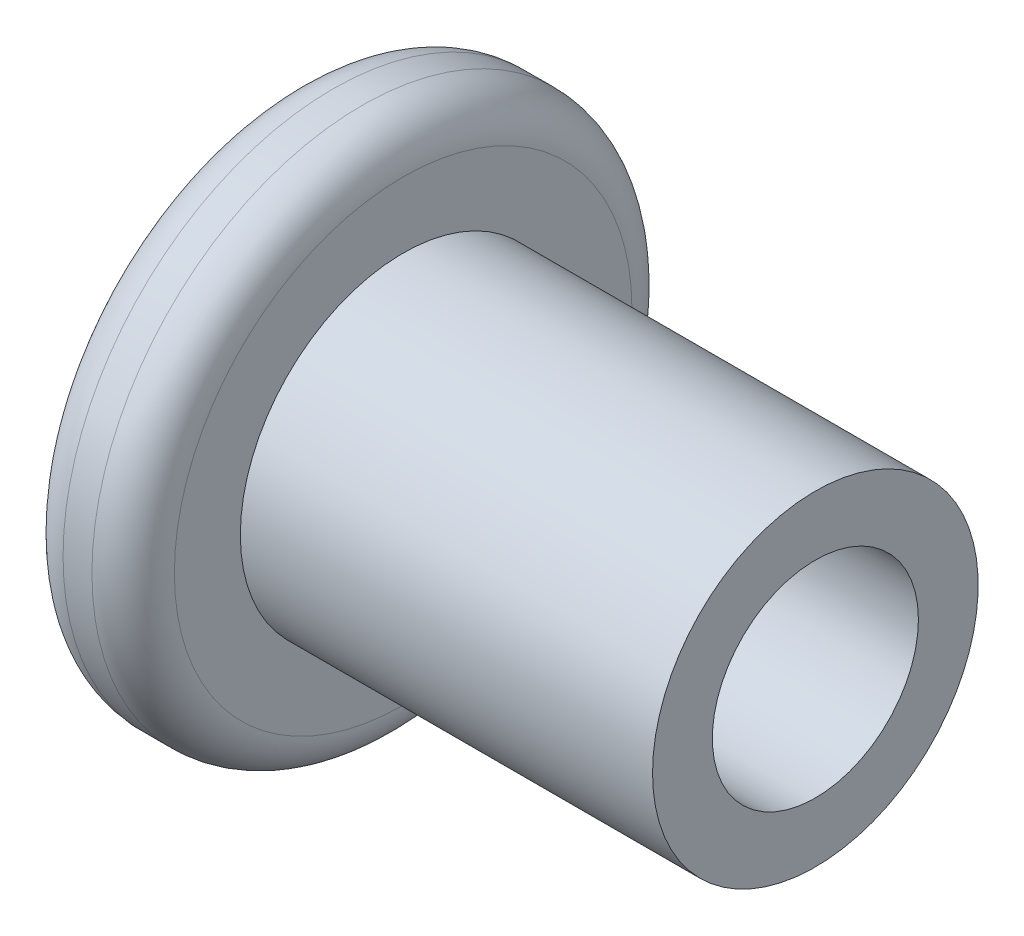
ISO-10303-21;
HEADER;
FILE_DESCRIPTION(('STEP AP214'),'2;1');
FILE_NAME('part.step','',(''),(''),'','','');
FILE_SCHEMA(('AUTOMOTIVE_DESIGN { 1 0 10303 214 1 1 1 1 }'));
ENDSEC;
DATA;
#1=APPLICATION_CONTEXT('core data for automotive mechanical design processes');
#2=APPLICATION_PROTOCOL_DEFINITION('international standard','automotive_design',2000,#1);
#3=PRODUCT_CONTEXT('',#1,'mechanical');
#4=PRODUCT('Part','Part','',(#3));
#5=PRODUCT_RELATED_PRODUCT_CATEGORY('part','',(#4));
#6=PRODUCT_DEFINITION_FORMATION('','',#4);
#7=PRODUCT_DEFINITION_CONTEXT('part definition',#1,'design');
#8=PRODUCT_DEFINITION('design','',#6,#7);
#9=PRODUCT_DEFINITION_SHAPE('','',#8);
#10=(LENGTH_UNIT() NAMED_UNIT(*) SI_UNIT(.MILLI.,.METRE.));
#11=(NAMED_UNIT(*) PLANE_ANGLE_UNIT() SI_UNIT($,.RADIAN.));
#12=(NAMED_UNIT(*) SI_UNIT($,.STERADIAN.) SOLID_ANGLE_UNIT());
#13=UNCERTAINTY_MEASURE_WITH_UNIT(LENGTH_MEASURE(1.E-05),#10,'distance_accuracy_value','');
#14=(GEOMETRIC_REPRESENTATION_CONTEXT(3) GLOBAL_UNCERTAINTY_ASSIGNED_CONTEXT((#13)) GLOBAL_UNIT_ASSIGNED_CONTEXT((#10,
#11,#12)) REPRESENTATION_CONTEXT('',''));
#15=CARTESIAN_POINT('',(0.,0.,0.));
#16=DIRECTION('',(0.,0.,1.));
#17=DIRECTION('',(1.,0.,0.));
#18=AXIS2_PLACEMENT_3D('',#15,#16,#17);
#19=CARTESIAN_POINT('',(0.,0.,0.));
#20=DIRECTION('',(1.,0.,0.));
#21=DIRECTION('',(0.,0.,-1.));
#22=AXIS2_PLACEMENT_3D('',#19,#20,#21);
#23=PLANE('',#22);
#24=DIRECTION('',(0.,0.,-1.));
#25=VECTOR('',#24,1.);
#26=CARTESIAN_POINT('',(0.,2.,1.15470053837925));
#27=LINE('',#26,#25);
#28=CARTESIAN_POINT('',(0.,2.,1.15470053837925));
#29=VERTEX_POINT('',#28);
#30=CARTESIAN_POINT('',(0.,2.,-1.15470053837925));
#31=VERTEX_POINT('',#30);
#32=EDGE_CURVE('E131',#29,#31,#27,.T.);
#33=ORIENTED_EDGE('',*,*,#32,.F.);
#34=DIRECTION('',(0.,0.866025403784438,-0.5));
#35=VECTOR('',#34,1.);
#36=CARTESIAN_POINT('',(0.,0.,2.3094010767585));
#37=LINE('',#36,#35);
#38=CARTESIAN_POINT('',(0.,0.,2.3094010767585));
#39=VERTEX_POINT('',#38);
#40=EDGE_CURVE('E55',#39,#29,#37,.T.);
#41=ORIENTED_EDGE('',*,*,#40,.F.);
#42=DIRECTION('',(0.,0.866025403784439,0.5));
#43=VECTOR('',#42,1.);
#44=CARTESIAN_POINT('',(0.,-2.,1.15470053837925));
#45=LINE('',#44,#43);
#46=CARTESIAN_POINT('',(0.,-2.,1.15470053837925));
#47=VERTEX_POINT('',#46);
#48=EDGE_CURVE('E141',#47,#39,#45,.T.);
#49=ORIENTED_EDGE('',*,*,#48,.F.);
#50=DIRECTION('',(0.,0.,1.));
#51=VECTOR('',#50,1.);
#52=CARTESIAN_POINT('',(0.,-2.,-1.15470053837925));
#53=LINE('',#52,#51);
#54=CARTESIAN_POINT('',(0.,-2.,-1.15470053837925));
#55=VERTEX_POINT('',#54);
#56=EDGE_CURVE('E139',#55,#47,#53,.T.);
#57=ORIENTED_EDGE('',*,*,#56,.F.);
#58=DIRECTION('',(0.,-0.866025403784439,0.5));
#59=VECTOR('',#58,1.);
#60=CARTESIAN_POINT('',(0.,0.,-2.3094010767585));
#61=LINE('',#60,#59);
#62=CARTESIAN_POINT('',(0.,0.,-2.3094010767585));
#63=VERTEX_POINT('',#62);
#64=EDGE_CURVE('E105',#63,#55,#61,.T.);
#65=ORIENTED_EDGE('',*,*,#64,.F.);
#66=DIRECTION('',(0.,-0.866025403784439,-0.5));
#67=VECTOR('',#66,1.);
#68=CARTESIAN_POINT('',(0.,2.,-1.15470053837925));
#69=LINE('',#68,#67);
#70=EDGE_CURVE('E135',#31,#63,#69,.T.);
#71=ORIENTED_EDGE('',*,*,#70,.F.);
#72=EDGE_LOOP('',(#33,#41,#49,#57,#65,#71));
#73=FACE_BOUND('',#72,.T.);
#74=CARTESIAN_POINT('',(0.,0.,0.));
#75=DIRECTION('',(1.,0.,0.));
#76=DIRECTION('',(0.,0.,-1.));
#77=AXIS2_PLACEMENT_3D('',#74,#75,#76);
#78=CIRCLE('',#77,5.55);
#79=CARTESIAN_POINT('',(0.,0.,-5.55));
#80=VERTEX_POINT('',#79);
#81=EDGE_CURVE('E11',#80,#80,#78,.F.);
#82=ORIENTED_EDGE('',*,*,#81,.T.);
#83=EDGE_LOOP('',(#82));
#84=FACE_BOUND('',#83,.T.);
#85=ADVANCED_FACE('F40',(#73,#84),#23,.F.);
#86=CARTESIAN_POINT('',(0.,0.,0.));
#87=DIRECTION('',(-1.,0.,0.));
#88=DIRECTION('',(0.,0.,1.));
#89=AXIS2_PLACEMENT_3D('',#86,#87,#88);
#90=CYLINDRICAL_SURFACE('',#89,6.55);
#91=CARTESIAN_POINT('',(1.7,0.,0.));
#92=DIRECTION('',(-1.,0.,0.));
#93=DIRECTION('',(0.,0.,1.));
#94=AXIS2_PLACEMENT_3D('',#91,#92,#93);
#95=CIRCLE('',#94,6.55);
#96=CARTESIAN_POINT('',(1.7,0.,6.55));
#97=VERTEX_POINT('',#96);
#98=EDGE_CURVE('E159',#97,#97,#95,.T.);
#99=ORIENTED_EDGE('',*,*,#98,.T.);
#100=EDGE_LOOP('',(#99));
#101=FACE_BOUND('',#100,.T.);
#102=CARTESIAN_POINT('',(1.,0.,0.));
#103=DIRECTION('',(1.,0.,0.));
#104=DIRECTION('',(0.,0.,-1.));
#105=AXIS2_PLACEMENT_3D('',#102,#103,#104);
#106=CIRCLE('',#105,6.55);
#107=CARTESIAN_POINT('',(1.,0.,-6.55));
#108=VERTEX_POINT('',#107);
#109=EDGE_CURVE('E156',#108,#108,#106,.T.);
#110=ORIENTED_EDGE('',*,*,#109,.T.);
#111=EDGE_LOOP('',(#110));
#112=FACE_BOUND('',#111,.T.);
#113=ADVANCED_FACE('F173',(#101,#112),#90,.T.);
#114=CARTESIAN_POINT('',(2.7,6.55,0.));
#115=DIRECTION('',(-1.,0.,0.));
#116=DIRECTION('',(0.,0.,1.));
#117=AXIS2_PLACEMENT_3D('',#114,#115,#116);
#118=PLANE('',#117);
#119=CARTESIAN_POINT('',(2.7,0.,0.));
#120=DIRECTION('',(-1.,0.,0.));
#121=DIRECTION('',(0.,0.,1.));
#122=AXIS2_PLACEMENT_3D('',#119,#120,#121);
#123=CIRCLE('',#122,5.55);
#124=CARTESIAN_POINT('',(2.7,0.,5.55));
#125=VERTEX_POINT('',#124);
#126=EDGE_CURVE('E48',#125,#125,#123,.F.);
#127=ORIENTED_EDGE('',*,*,#126,.T.);
#128=EDGE_LOOP('',(#127));
#129=FACE_BOUND('',#128,.T.);
#130=CARTESIAN_POINT('',(2.7,0.,0.));
#131=DIRECTION('',(-1.,0.,0.));
#132=DIRECTION('',(0.,0.,1.));
#133=AXIS2_PLACEMENT_3D('',#130,#131,#132);
#134=CIRCLE('',#133,3.95);
#135=CARTESIAN_POINT('',(2.7,0.,3.95));
#136=VERTEX_POINT('',#135);
#137=EDGE_CURVE('E153',#136,#136,#134,.T.);
#138=ORIENTED_EDGE('',*,*,#137,.T.);
#139=EDGE_LOOP('',(#138));
#140=FACE_BOUND('',#139,.T.);
#141=ADVANCED_FACE('F164',(#129,#140),#118,.F.);
#142=CARTESIAN_POINT('',(0.,0.,0.));
#143=DIRECTION('',(-1.,0.,0.));
#144=DIRECTION('',(0.,0.,1.));
#145=AXIS2_PLACEMENT_3D('',#142,#143,#144);
#146=CYLINDRICAL_SURFACE('',#145,3.95);
#147=ORIENTED_EDGE('',*,*,#137,.F.);
#148=EDGE_LOOP('',(#147));
#149=FACE_BOUND('',#148,.T.);
#150=CARTESIAN_POINT('',(12.7,0.,0.));
#151=DIRECTION('',(-1.,0.,0.));
#152=DIRECTION('',(0.,0.,1.));
#153=AXIS2_PLACEMENT_3D('',#150,#151,#152);
#154=CIRCLE('',#153,3.95);
#155=CARTESIAN_POINT('',(12.7,0.,3.95));
#156=VERTEX_POINT('',#155);
#157=EDGE_CURVE('E145',#156,#156,#154,.T.);
#158=ORIENTED_EDGE('',*,*,#157,.T.);
#159=EDGE_LOOP('',(#158));
#160=FACE_BOUND('',#159,.T.);
#161=ADVANCED_FACE('F193',(#149,#160),#146,.T.);
#162=CARTESIAN_POINT('',(12.7,3.95,0.));
#163=DIRECTION('',(-1.,0.,0.));
#164=DIRECTION('',(0.,0.,1.));
#165=AXIS2_PLACEMENT_3D('',#162,#163,#164);
#166=PLANE('',#165);
#167=CARTESIAN_POINT('',(12.7,0.,0.));
#168=DIRECTION('',(1.,0.,0.));
#169=DIRECTION('',(0.,0.,-1.));
#170=AXIS2_PLACEMENT_3D('',#167,#168,#169);
#171=CIRCLE('',#170,2.5);
#172=CARTESIAN_POINT('',(12.7,0.,-2.5));
#173=VERTEX_POINT('',#172);
#174=EDGE_CURVE('E233',#173,#173,#171,.T.);
#175=ORIENTED_EDGE('',*,*,#174,.F.);
#176=EDGE_LOOP('',(#175));
#177=FACE_BOUND('',#176,.T.);
#178=ORIENTED_EDGE('',*,*,#157,.F.);
#179=EDGE_LOOP('',(#178));
#180=FACE_BOUND('',#179,.T.);
#181=ADVANCED_FACE('F170',(#177,#180),#166,.F.);
#182=CARTESIAN_POINT('',(1.7,0.,0.));
#183=DIRECTION('',(-1.,0.,0.));
#184=DIRECTION('',(0.,0.,1.));
#185=AXIS2_PLACEMENT_3D('',#182,#183,#184);
#186=TOROIDAL_SURFACE('',#185,5.55,1.);
#187=ORIENTED_EDGE('',*,*,#126,.F.);
#188=EDGE_LOOP('',(#187));
#189=FACE_BOUND('',#188,.T.);
#190=ORIENTED_EDGE('',*,*,#98,.F.);
#191=EDGE_LOOP('',(#190));
#192=FACE_BOUND('',#191,.T.);
#193=ADVANCED_FACE('F167',(#189,#192),#186,.T.);
#194=CARTESIAN_POINT('',(1.,0.,0.));
#195=DIRECTION('',(1.,0.,0.));
#196=DIRECTION('',(0.,0.,-1.));
#197=AXIS2_PLACEMENT_3D('',#194,#195,#196);
#198=TOROIDAL_SURFACE('',#197,5.55,1.);
#199=ORIENTED_EDGE('',*,*,#109,.F.);
#200=EDGE_LOOP('',(#199));
#201=FACE_BOUND('',#200,.T.);
#202=ORIENTED_EDGE('',*,*,#81,.F.);
#203=EDGE_LOOP('',(#202));
#204=FACE_BOUND('',#203,.T.);
#205=ADVANCED_FACE('F42',(#201,#204),#198,.T.);
#206=CARTESIAN_POINT('',(1.,0.,2.3094010767585));
#207=DIRECTION('',(0.,0.5,0.866025403784439));
#208=DIRECTION('',(0.,-0.866025403784439,0.5));
#209=AXIS2_PLACEMENT_3D('',#206,#207,#208);
#210=PLANE('',#209);
#211=ORIENTED_EDGE('',*,*,#40,.T.);
#212=DIRECTION('',(-1.,0.,0.));
#213=VECTOR('',#212,1.);
#214=CARTESIAN_POINT('',(1.,2.,1.15470053837925));
#215=LINE('',#214,#213);
#216=CARTESIAN_POINT('',(1.,2.,1.15470053837925));
#217=VERTEX_POINT('',#216);
#218=EDGE_CURVE('E86',#217,#29,#215,.T.);
#219=ORIENTED_EDGE('',*,*,#218,.F.);
#220=DIRECTION('',(0.,0.866025403784438,-0.5));
#221=VECTOR('',#220,1.);
#222=CARTESIAN_POINT('',(1.,0.,2.3094010767585));
#223=LINE('',#222,#221);
#224=CARTESIAN_POINT('',(1.,0.,2.3094010767585));
#225=VERTEX_POINT('',#224);
#226=EDGE_CURVE('E143',#225,#217,#223,.T.);
#227=ORIENTED_EDGE('',*,*,#226,.F.);
#228=DIRECTION('',(-1.,0.,0.));
#229=VECTOR('',#228,1.);
#230=CARTESIAN_POINT('',(1.,0.,2.3094010767585));
#231=LINE('',#230,#229);
#232=EDGE_CURVE('E63',#225,#39,#231,.T.);
#233=ORIENTED_EDGE('',*,*,#232,.T.);
#234=EDGE_LOOP('',(#211,#219,#227,#233));
#235=FACE_BOUND('',#234,.T.);
#236=ADVANCED_FACE('F181',(#235),#210,.F.);
#237=CARTESIAN_POINT('',(1.,-2.,1.15470053837925));
#238=DIRECTION('',(0.,-0.5,0.866025403784439));
#239=DIRECTION('',(0.,-0.866025403784439,-0.5));
#240=AXIS2_PLACEMENT_3D('',#237,#238,#239);
#241=PLANE('',#240);
#242=ORIENTED_EDGE('',*,*,#48,.T.);
#243=ORIENTED_EDGE('',*,*,#232,.F.);
#244=DIRECTION('',(0.,0.866025403784439,0.5));
#245=VECTOR('',#244,1.);
#246=CARTESIAN_POINT('',(1.,-2.,1.15470053837925));
#247=LINE('',#246,#245);
#248=CARTESIAN_POINT('',(1.,-2.,1.15470053837925));
#249=VERTEX_POINT('',#248);
#250=EDGE_CURVE('E117',#249,#225,#247,.T.);
#251=ORIENTED_EDGE('',*,*,#250,.F.);
#252=DIRECTION('',(-1.,0.,0.));
#253=VECTOR('',#252,1.);
#254=CARTESIAN_POINT('',(1.,-2.,1.15470053837925));
#255=LINE('',#254,#253);
#256=EDGE_CURVE('E109',#249,#47,#255,.T.);
#257=ORIENTED_EDGE('',*,*,#256,.T.);
#258=EDGE_LOOP('',(#242,#243,#251,#257));
#259=FACE_BOUND('',#258,.T.);
#260=ADVANCED_FACE('F202',(#259),#241,.F.);
#261=CARTESIAN_POINT('',(1.,-2.,-1.15470053837925));
#262=DIRECTION('',(0.,-1.,0.));
#263=DIRECTION('',(0.,0.,-1.));
#264=AXIS2_PLACEMENT_3D('',#261,#262,#263);
#265=PLANE('',#264);
#266=ORIENTED_EDGE('',*,*,#56,.T.);
#267=ORIENTED_EDGE('',*,*,#256,.F.);
#268=DIRECTION('',(0.,0.,1.));
#269=VECTOR('',#268,1.);
#270=CARTESIAN_POINT('',(1.,-2.,-1.15470053837925));
#271=LINE('',#270,#269);
#272=CARTESIAN_POINT('',(1.,-2.,-1.15470053837925));
#273=VERTEX_POINT('',#272);
#274=EDGE_CURVE('E113',#273,#249,#271,.T.);
#275=ORIENTED_EDGE('',*,*,#274,.F.);
#276=DIRECTION('',(-1.,0.,0.));
#277=VECTOR('',#276,1.);
#278=CARTESIAN_POINT('',(1.,-2.,-1.15470053837925));
#279=LINE('',#278,#277);
#280=EDGE_CURVE('E98',#273,#55,#279,.T.);
#281=ORIENTED_EDGE('',*,*,#280,.T.);
#282=EDGE_LOOP('',(#266,#267,#275,#281));
#283=FACE_BOUND('',#282,.T.);
#284=ADVANCED_FACE('F114',(#283),#265,.F.);
#285=CARTESIAN_POINT('',(1.,0.,-2.3094010767585));
#286=DIRECTION('',(0.,-0.5,-0.866025403784439));
#287=DIRECTION('',(0.,0.866025403784439,-0.5));
#288=AXIS2_PLACEMENT_3D('',#285,#286,#287);
#289=PLANE('',#288);
#290=ORIENTED_EDGE('',*,*,#64,.T.);
#291=ORIENTED_EDGE('',*,*,#280,.F.);
#292=DIRECTION('',(0.,-0.866025403784439,0.5));
#293=VECTOR('',#292,1.);
#294=CARTESIAN_POINT('',(1.,0.,-2.3094010767585));
#295=LINE('',#294,#293);
#296=CARTESIAN_POINT('',(1.,0.,-2.3094010767585));
#297=VERTEX_POINT('',#296);
#298=EDGE_CURVE('E102',#297,#273,#295,.T.);
#299=ORIENTED_EDGE('',*,*,#298,.F.);
#300=DIRECTION('',(-1.,0.,0.));
#301=VECTOR('',#300,1.);
#302=CARTESIAN_POINT('',(1.,0.,-2.3094010767585));
#303=LINE('',#302,#301);
#304=EDGE_CURVE('E110',#297,#63,#303,.T.);
#305=ORIENTED_EDGE('',*,*,#304,.T.);
#306=EDGE_LOOP('',(#290,#291,#299,#305));
#307=FACE_BOUND('',#306,.T.);
#308=ADVANCED_FACE('F100',(#307),#289,.F.);
#309=CARTESIAN_POINT('',(1.,2.,-1.15470053837925));
#310=DIRECTION('',(0.,0.5,-0.866025403784439));
#311=DIRECTION('',(0.,0.866025403784439,0.5));
#312=AXIS2_PLACEMENT_3D('',#309,#310,#311);
#313=PLANE('',#312);
#314=ORIENTED_EDGE('',*,*,#70,.T.);
#315=ORIENTED_EDGE('',*,*,#304,.F.);
#316=DIRECTION('',(0.,-0.866025403784439,-0.5));
#317=VECTOR('',#316,1.);
#318=CARTESIAN_POINT('',(1.,2.,-1.15470053837925));
#319=LINE('',#318,#317);
#320=CARTESIAN_POINT('',(1.,2.,-1.15470053837925));
#321=VERTEX_POINT('',#320);
#322=EDGE_CURVE('E123',#321,#297,#319,.T.);
#323=ORIENTED_EDGE('',*,*,#322,.F.);
#324=DIRECTION('',(-1.,0.,0.));
#325=VECTOR('',#324,1.);
#326=CARTESIAN_POINT('',(1.,2.,-1.15470053837925));
#327=LINE('',#326,#325);
#328=EDGE_CURVE('E148',#321,#31,#327,.T.);
#329=ORIENTED_EDGE('',*,*,#328,.T.);
#330=EDGE_LOOP('',(#314,#315,#323,#329));
#331=FACE_BOUND('',#330,.T.);
#332=ADVANCED_FACE('F206',(#331),#313,.F.);
#333=CARTESIAN_POINT('',(1.,2.,1.15470053837925));
#334=DIRECTION('',(0.,1.,0.));
#335=DIRECTION('',(0.,0.,1.));
#336=AXIS2_PLACEMENT_3D('',#333,#334,#335);
#337=PLANE('',#336);
#338=ORIENTED_EDGE('',*,*,#32,.T.);
#339=ORIENTED_EDGE('',*,*,#328,.F.);
#340=DIRECTION('',(0.,0.,-1.));
#341=VECTOR('',#340,1.);
#342=CARTESIAN_POINT('',(1.,2.,1.15470053837925));
#343=LINE('',#342,#341);
#344=EDGE_CURVE('E125',#217,#321,#343,.T.);
#345=ORIENTED_EDGE('',*,*,#344,.F.);
#346=ORIENTED_EDGE('',*,*,#218,.T.);
#347=EDGE_LOOP('',(#338,#339,#345,#346));
#348=FACE_BOUND('',#347,.T.);
#349=ADVANCED_FACE('F203',(#348),#337,.F.);
#350=CARTESIAN_POINT('',(1.,0.,0.));
#351=DIRECTION('',(-1.,0.,0.));
#352=DIRECTION('',(0.,0.,1.));
#353=AXIS2_PLACEMENT_3D('',#350,#351,#352);
#354=PLANE('',#353);
#355=ORIENTED_EDGE('',*,*,#226,.T.);
#356=ORIENTED_EDGE('',*,*,#344,.T.);
#357=ORIENTED_EDGE('',*,*,#322,.T.);
#358=ORIENTED_EDGE('',*,*,#298,.T.);
#359=ORIENTED_EDGE('',*,*,#274,.T.);
#360=ORIENTED_EDGE('',*,*,#250,.T.);
#361=EDGE_LOOP('',(#355,#356,#357,#358,#359,#360));
#362=FACE_BOUND('',#361,.T.);
#363=ADVANCED_FACE('F120',(#362),#354,.T.);
#364=CARTESIAN_POINT('',(8.6,0.,0.));
#365=DIRECTION('',(1.,0.,0.));
#366=DIRECTION('',(0.,0.,-1.));
#367=AXIS2_PLACEMENT_3D('',#364,#365,#366);
#368=CONICAL_SURFACE('',#367,2.5,1.02974425867665);
#369=CARTESIAN_POINT('',(7.0978484524311,0.,0.));
#370=VERTEX_POINT('',#369);
#371=VERTEX_LOOP('',#370);
#372=FACE_BOUND('',#371,.T.);
#373=CARTESIAN_POINT('',(8.6,0.,0.));
#374=DIRECTION('',(1.,0.,0.));
#375=DIRECTION('',(0.,0.,-1.));
#376=AXIS2_PLACEMENT_3D('',#373,#374,#375);
#377=CIRCLE('',#376,2.5);
#378=CARTESIAN_POINT('',(8.6,0.,-2.5));
#379=VERTEX_POINT('',#378);
#380=EDGE_CURVE('E132',#379,#379,#377,.T.);
#381=ORIENTED_EDGE('',*,*,#380,.T.);
#382=EDGE_LOOP('',(#381));
#383=FACE_BOUND('',#382,.T.);
#384=ADVANCED_FACE('F219',(#372,#383),#368,.F.);
#385=CARTESIAN_POINT('',(12.7,0.,0.));
#386=DIRECTION('',(1.,0.,0.));
#387=DIRECTION('',(0.,0.,-1.));
#388=AXIS2_PLACEMENT_3D('',#385,#386,#387);
#389=CYLINDRICAL_SURFACE('',#388,2.5);
#390=ORIENTED_EDGE('',*,*,#380,.F.);
#391=EDGE_LOOP('',(#390));
#392=FACE_BOUND('',#391,.T.);
#393=ORIENTED_EDGE('',*,*,#174,.T.);
#394=EDGE_LOOP('',(#393));
#395=FACE_BOUND('',#394,.T.);
#396=ADVANCED_FACE('F222',(#392,#395),#389,.F.);
#397=CLOSED_SHELL('',(#85,#113,#141,#161,#181,#193,#205,#236,#260,#284,#308,#332,#349,#363,#384,#396));
#398=MANIFOLD_SOLID_BREP('B2',#397);
#399=ADVANCED_BREP_SHAPE_REPRESENTATION('',(#18,#398),#14);
#400=SHAPE_DEFINITION_REPRESENTATION(#9,#399);
ENDSEC;
END-ISO-10303-21;
